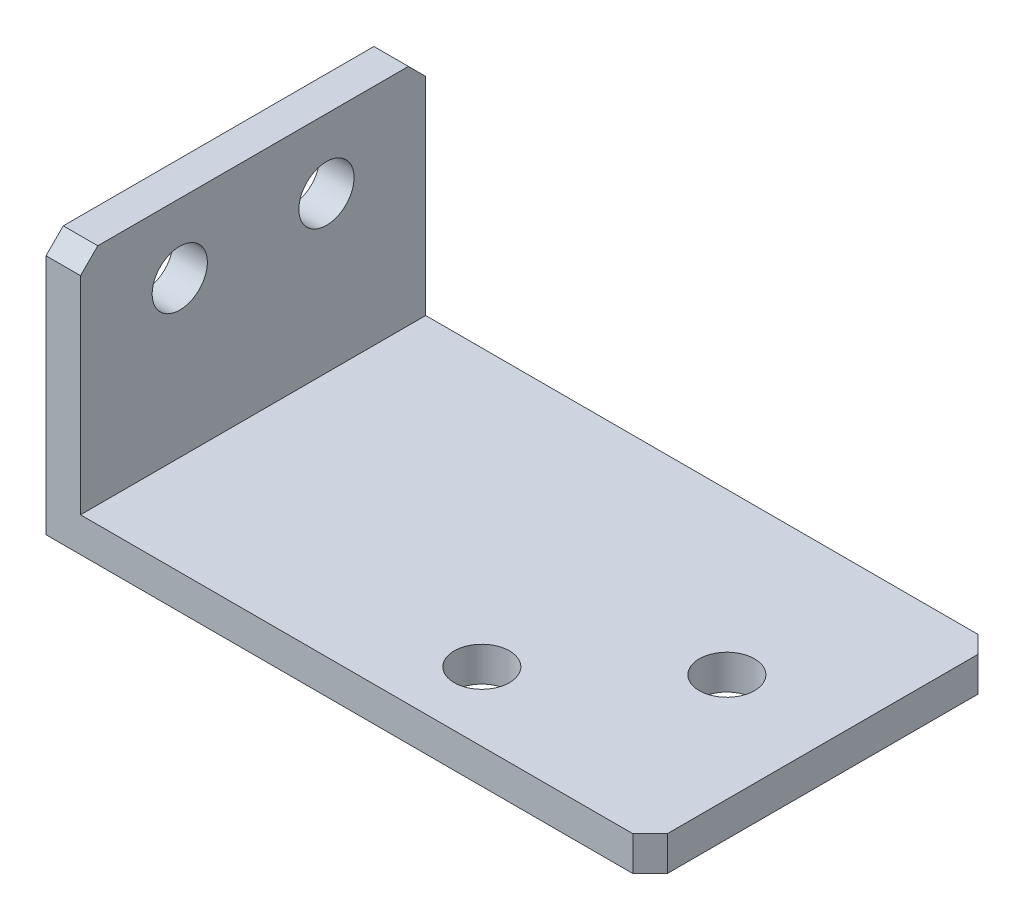
ISO-10303-21;
HEADER;
FILE_DESCRIPTION(('STEP AP214'),'2;1');
FILE_NAME('part.step','',(''),(''),'','','');
FILE_SCHEMA(('AUTOMOTIVE_DESIGN { 1 0 10303 214 1 1 1 1 }'));
ENDSEC;
DATA;
#1=APPLICATION_CONTEXT('core data for automotive mechanical design processes');
#2=APPLICATION_PROTOCOL_DEFINITION('international standard','automotive_design',2000,#1);
#3=PRODUCT_CONTEXT('',#1,'mechanical');
#4=PRODUCT('Part','Part','',(#3));
#5=PRODUCT_RELATED_PRODUCT_CATEGORY('part','',(#4));
#6=PRODUCT_DEFINITION_FORMATION('','',#4);
#7=PRODUCT_DEFINITION_CONTEXT('part definition',#1,'design');
#8=PRODUCT_DEFINITION('design','',#6,#7);
#9=PRODUCT_DEFINITION_SHAPE('','',#8);
#10=(LENGTH_UNIT() NAMED_UNIT(*) SI_UNIT(.MILLI.,.METRE.));
#11=(NAMED_UNIT(*) PLANE_ANGLE_UNIT() SI_UNIT($,.RADIAN.));
#12=(NAMED_UNIT(*) SI_UNIT($,.STERADIAN.) SOLID_ANGLE_UNIT());
#13=UNCERTAINTY_MEASURE_WITH_UNIT(LENGTH_MEASURE(1.E-05),#10,'distance_accuracy_value','');
#14=(GEOMETRIC_REPRESENTATION_CONTEXT(3) GLOBAL_UNCERTAINTY_ASSIGNED_CONTEXT((#13)) GLOBAL_UNIT_ASSIGNED_CONTEXT((#10,
#11,#12)) REPRESENTATION_CONTEXT('',''));
#15=CARTESIAN_POINT('',(0.,0.,0.));
#16=DIRECTION('',(0.,0.,1.));
#17=DIRECTION('',(1.,0.,0.));
#18=AXIS2_PLACEMENT_3D('',#15,#16,#17);
#19=CARTESIAN_POINT('',(0.,15.,20.));
#20=DIRECTION('',(1.,0.,0.));
#21=DIRECTION('',(0.,1.,0.));
#22=AXIS2_PLACEMENT_3D('',#19,#20,#21);
#23=PLANE('',#22);
#24=CARTESIAN_POINT('',(0.,11.,5.75));
#25=DIRECTION('',(-1.,0.,0.));
#26=DIRECTION('',(0.,0.,1.));
#27=AXIS2_PLACEMENT_3D('',#24,#25,#26);
#28=CIRCLE('',#27,1.59999999999999);
#29=CARTESIAN_POINT('',(0.,11.,7.34999999999999));
#30=VERTEX_POINT('',#29);
#31=EDGE_CURVE('E374',#30,#30,#28,.T.);
#32=ORIENTED_EDGE('',*,*,#31,.F.);
#33=EDGE_LOOP('',(#32));
#34=FACE_BOUND('',#33,.T.);
#35=CARTESIAN_POINT('',(0.,11.,14.25));
#36=DIRECTION('',(-1.,0.,0.));
#37=DIRECTION('',(0.,0.,1.));
#38=AXIS2_PLACEMENT_3D('',#35,#36,#37);
#39=CIRCLE('',#38,1.59999999999999);
#40=CARTESIAN_POINT('',(0.,11.,15.85));
#41=VERTEX_POINT('',#40);
#42=EDGE_CURVE('E380',#41,#41,#39,.T.);
#43=ORIENTED_EDGE('',*,*,#42,.F.);
#44=EDGE_LOOP('',(#43));
#45=FACE_BOUND('',#44,.T.);
#46=DIRECTION('',(0.,0.,-1.));
#47=VECTOR('',#46,1.);
#48=CARTESIAN_POINT('',(0.,15.,20.));
#49=LINE('',#48,#47);
#50=CARTESIAN_POINT('',(0.,15.,19.));
#51=VERTEX_POINT('',#50);
#52=CARTESIAN_POINT('',(0.,15.,0.999999999999997));
#53=VERTEX_POINT('',#52);
#54=EDGE_CURVE('E181',#51,#53,#49,.T.);
#55=ORIENTED_EDGE('',*,*,#54,.T.);
#56=DIRECTION('',(0.,0.70710678118655,0.707106781186545));
#57=VECTOR('',#56,1.);
#58=CARTESIAN_POINT('',(0.,15.,0.999999999999997));
#59=LINE('',#58,#57);
#60=CARTESIAN_POINT('',(0.,14.,0.));
#61=VERTEX_POINT('',#60);
#62=EDGE_CURVE('E166',#53,#61,#59,.F.);
#63=ORIENTED_EDGE('',*,*,#62,.T.);
#64=DIRECTION('',(0.,-1.,0.));
#65=VECTOR('',#64,1.);
#66=CARTESIAN_POINT('',(0.,15.,0.));
#67=LINE('',#66,#65);
#68=CARTESIAN_POINT('',(0.,0.,0.));
#69=VERTEX_POINT('',#68);
#70=EDGE_CURVE('E135',#61,#69,#67,.T.);
#71=ORIENTED_EDGE('',*,*,#70,.T.);
#72=DIRECTION('',(0.,0.,-1.));
#73=VECTOR('',#72,1.);
#74=CARTESIAN_POINT('',(0.,0.,20.));
#75=LINE('',#74,#73);
#76=CARTESIAN_POINT('',(0.,0.,20.));
#77=VERTEX_POINT('',#76);
#78=EDGE_CURVE('E127',#77,#69,#75,.T.);
#79=ORIENTED_EDGE('',*,*,#78,.F.);
#80=DIRECTION('',(0.,-1.,0.));
#81=VECTOR('',#80,1.);
#82=CARTESIAN_POINT('',(0.,15.,20.));
#83=LINE('',#82,#81);
#84=CARTESIAN_POINT('',(0.,14.,20.));
#85=VERTEX_POINT('',#84);
#86=EDGE_CURVE('E113',#85,#77,#83,.T.);
#87=ORIENTED_EDGE('',*,*,#86,.F.);
#88=DIRECTION('',(0.,0.707106781186545,-0.70710678118655));
#89=VECTOR('',#88,1.);
#90=CARTESIAN_POINT('',(0.,14.,20.));
#91=LINE('',#90,#89);
#92=EDGE_CURVE('E57',#85,#51,#91,.T.);
#93=ORIENTED_EDGE('',*,*,#92,.T.);
#94=EDGE_LOOP('',(#55,#63,#71,#79,#87,#93));
#95=FACE_BOUND('',#94,.T.);
#96=ADVANCED_FACE('F34',(#34,#45,#95),#23,.F.);
#97=CARTESIAN_POINT('',(0.,0.,20.));
#98=DIRECTION('',(0.,1.,0.));
#99=DIRECTION('',(0.,0.,1.));
#100=AXIS2_PLACEMENT_3D('',#97,#98,#99);
#101=PLANE('',#100);
#102=CARTESIAN_POINT('',(28.75,0.,9.3));
#103=DIRECTION('',(0.,-1.,0.));
#104=DIRECTION('',(0.,0.,-1.));
#105=AXIS2_PLACEMENT_3D('',#102,#103,#104);
#106=CIRCLE('',#105,1.6);
#107=CARTESIAN_POINT('',(28.75,0.,7.7));
#108=VERTEX_POINT('',#107);
#109=EDGE_CURVE('E361',#108,#108,#106,.T.);
#110=ORIENTED_EDGE('',*,*,#109,.F.);
#111=EDGE_LOOP('',(#110));
#112=FACE_BOUND('',#111,.T.);
#113=CARTESIAN_POINT('',(21.25,0.,16.));
#114=DIRECTION('',(0.,-1.,0.));
#115=DIRECTION('',(0.,0.,-1.));
#116=AXIS2_PLACEMENT_3D('',#113,#114,#115);
#117=CIRCLE('',#116,1.6);
#118=CARTESIAN_POINT('',(21.25,0.,14.4));
#119=VERTEX_POINT('',#118);
#120=EDGE_CURVE('E365',#119,#119,#117,.T.);
#121=ORIENTED_EDGE('',*,*,#120,.F.);
#122=EDGE_LOOP('',(#121));
#123=FACE_BOUND('',#122,.T.);
#124=DIRECTION('',(1.,0.,0.));
#125=VECTOR('',#124,1.);
#126=CARTESIAN_POINT('',(0.,0.,0.));
#127=LINE('',#126,#125);
#128=CARTESIAN_POINT('',(34.,0.,0.));
#129=VERTEX_POINT('',#128);
#130=EDGE_CURVE('E185',#69,#129,#127,.T.);
#131=ORIENTED_EDGE('',*,*,#130,.T.);
#132=DIRECTION('',(-0.707106781186549,0.,-0.707106781186546));
#133=VECTOR('',#132,1.);
#134=CARTESIAN_POINT('',(35.,0.,0.999999999999997));
#135=LINE('',#134,#133);
#136=CARTESIAN_POINT('',(35.,0.,0.999999999999997));
#137=VERTEX_POINT('',#136);
#138=EDGE_CURVE('E158',#129,#137,#135,.F.);
#139=ORIENTED_EDGE('',*,*,#138,.T.);
#140=DIRECTION('',(0.,0.,-1.));
#141=VECTOR('',#140,1.);
#142=CARTESIAN_POINT('',(35.,0.,20.));
#143=LINE('',#142,#141);
#144=CARTESIAN_POINT('',(35.,0.,19.));
#145=VERTEX_POINT('',#144);
#146=EDGE_CURVE('E138',#145,#137,#143,.T.);
#147=ORIENTED_EDGE('',*,*,#146,.F.);
#148=DIRECTION('',(-0.707106781186543,0.,0.707106781186552));
#149=VECTOR('',#148,1.);
#150=CARTESIAN_POINT('',(34.,0.,20.));
#151=LINE('',#150,#149);
#152=CARTESIAN_POINT('',(34.,0.,20.));
#153=VERTEX_POINT('',#152);
#154=EDGE_CURVE('E130',#145,#153,#151,.T.);
#155=ORIENTED_EDGE('',*,*,#154,.T.);
#156=DIRECTION('',(1.,0.,0.));
#157=VECTOR('',#156,1.);
#158=CARTESIAN_POINT('',(0.,0.,20.));
#159=LINE('',#158,#157);
#160=EDGE_CURVE('E117',#77,#153,#159,.T.);
#161=ORIENTED_EDGE('',*,*,#160,.F.);
#162=ORIENTED_EDGE('',*,*,#78,.T.);
#163=EDGE_LOOP('',(#131,#139,#147,#155,#161,#162));
#164=FACE_BOUND('',#163,.T.);
#165=ADVANCED_FACE('F126',(#112,#123,#164),#101,.F.);
#166=CARTESIAN_POINT('',(35.,0.,20.));
#167=DIRECTION('',(-1.,0.,0.));
#168=DIRECTION('',(0.,0.,1.));
#169=AXIS2_PLACEMENT_3D('',#166,#167,#168);
#170=PLANE('',#169);
#171=ORIENTED_EDGE('',*,*,#146,.T.);
#172=DIRECTION('',(0.,1.,0.));
#173=VECTOR('',#172,1.);
#174=CARTESIAN_POINT('',(35.,0.,0.999999999999997));
#175=LINE('',#174,#173);
#176=CARTESIAN_POINT('',(35.,2.,0.999999999999997));
#177=VERTEX_POINT('',#176);
#178=EDGE_CURVE('E140',#137,#177,#175,.T.);
#179=ORIENTED_EDGE('',*,*,#178,.T.);
#180=DIRECTION('',(0.,0.,-1.));
#181=VECTOR('',#180,1.);
#182=CARTESIAN_POINT('',(35.,2.,20.));
#183=LINE('',#182,#181);
#184=CARTESIAN_POINT('',(35.,2.,19.));
#185=VERTEX_POINT('',#184);
#186=EDGE_CURVE('E143',#185,#177,#183,.T.);
#187=ORIENTED_EDGE('',*,*,#186,.F.);
#188=DIRECTION('',(0.,-1.,0.));
#189=VECTOR('',#188,1.);
#190=CARTESIAN_POINT('',(35.,0.,19.));
#191=LINE('',#190,#189);
#192=EDGE_CURVE('E137',#185,#145,#191,.T.);
#193=ORIENTED_EDGE('',*,*,#192,.T.);
#194=EDGE_LOOP('',(#171,#179,#187,#193));
#195=FACE_BOUND('',#194,.T.);
#196=ADVANCED_FACE('F199',(#195),#170,.F.);
#197=CARTESIAN_POINT('',(35.,2.,20.));
#198=DIRECTION('',(0.,-1.,0.));
#199=DIRECTION('',(1.,0.,0.));
#200=AXIS2_PLACEMENT_3D('',#197,#198,#199);
#201=PLANE('',#200);
#202=CARTESIAN_POINT('',(28.75,2.,9.3));
#203=DIRECTION('',(0.,-1.,0.));
#204=DIRECTION('',(1.,0.,0.));
#205=AXIS2_PLACEMENT_3D('',#202,#203,#204);
#206=CIRCLE('',#205,1.6);
#207=CARTESIAN_POINT('',(30.35,2.,9.3));
#208=VERTEX_POINT('',#207);
#209=EDGE_CURVE('E364',#208,#208,#206,.T.);
#210=ORIENTED_EDGE('',*,*,#209,.T.);
#211=EDGE_LOOP('',(#210));
#212=FACE_BOUND('',#211,.T.);
#213=CARTESIAN_POINT('',(21.25,2.,16.));
#214=DIRECTION('',(0.,-1.,0.));
#215=DIRECTION('',(1.,0.,0.));
#216=AXIS2_PLACEMENT_3D('',#213,#214,#215);
#217=CIRCLE('',#216,1.6);
#218=CARTESIAN_POINT('',(22.85,2.,16.));
#219=VERTEX_POINT('',#218);
#220=EDGE_CURVE('E368',#219,#219,#217,.T.);
#221=ORIENTED_EDGE('',*,*,#220,.T.);
#222=EDGE_LOOP('',(#221));
#223=FACE_BOUND('',#222,.T.);
#224=ORIENTED_EDGE('',*,*,#186,.T.);
#225=DIRECTION('',(0.707106781186549,0.,0.707106781186546));
#226=VECTOR('',#225,1.);
#227=CARTESIAN_POINT('',(35.,2.,0.999999999999997));
#228=LINE('',#227,#226);
#229=CARTESIAN_POINT('',(34.,2.,0.));
#230=VERTEX_POINT('',#229);
#231=EDGE_CURVE('E151',#177,#230,#228,.F.);
#232=ORIENTED_EDGE('',*,*,#231,.T.);
#233=DIRECTION('',(-1.,0.,0.));
#234=VECTOR('',#233,1.);
#235=CARTESIAN_POINT('',(35.,2.,0.));
#236=LINE('',#235,#234);
#237=CARTESIAN_POINT('',(2.,2.,0.));
#238=VERTEX_POINT('',#237);
#239=EDGE_CURVE('E188',#230,#238,#236,.T.);
#240=ORIENTED_EDGE('',*,*,#239,.T.);
#241=DIRECTION('',(0.,0.,-1.));
#242=VECTOR('',#241,1.);
#243=CARTESIAN_POINT('',(2.,2.,20.));
#244=LINE('',#243,#242);
#245=CARTESIAN_POINT('',(2.,2.,20.));
#246=VERTEX_POINT('',#245);
#247=EDGE_CURVE('E178',#246,#238,#244,.T.);
#248=ORIENTED_EDGE('',*,*,#247,.F.);
#249=DIRECTION('',(-1.,0.,0.));
#250=VECTOR('',#249,1.);
#251=CARTESIAN_POINT('',(35.,2.,20.));
#252=LINE('',#251,#250);
#253=CARTESIAN_POINT('',(34.,2.,20.));
#254=VERTEX_POINT('',#253);
#255=EDGE_CURVE('E131',#254,#246,#252,.T.);
#256=ORIENTED_EDGE('',*,*,#255,.F.);
#257=DIRECTION('',(0.707106781186543,0.,-0.707106781186552));
#258=VECTOR('',#257,1.);
#259=CARTESIAN_POINT('',(34.,2.,20.));
#260=LINE('',#259,#258);
#261=EDGE_CURVE('E149',#254,#185,#260,.T.);
#262=ORIENTED_EDGE('',*,*,#261,.T.);
#263=EDGE_LOOP('',(#224,#232,#240,#248,#256,#262));
#264=FACE_BOUND('',#263,.T.);
#265=ADVANCED_FACE('F175',(#212,#223,#264),#201,.F.);
#266=CARTESIAN_POINT('',(2.,2.,20.));
#267=DIRECTION('',(-1.,0.,0.));
#268=DIRECTION('',(0.,-1.,0.));
#269=AXIS2_PLACEMENT_3D('',#266,#267,#268);
#270=PLANE('',#269);
#271=CARTESIAN_POINT('',(2.,11.,5.75));
#272=DIRECTION('',(-1.,0.,0.));
#273=DIRECTION('',(0.,-1.,0.));
#274=AXIS2_PLACEMENT_3D('',#271,#272,#273);
#275=CIRCLE('',#274,1.59999999999999);
#276=CARTESIAN_POINT('',(2.,9.40000000000001,5.75));
#277=VERTEX_POINT('',#276);
#278=EDGE_CURVE('E377',#277,#277,#275,.T.);
#279=ORIENTED_EDGE('',*,*,#278,.T.);
#280=EDGE_LOOP('',(#279));
#281=FACE_BOUND('',#280,.T.);
#282=CARTESIAN_POINT('',(2.,11.,14.25));
#283=DIRECTION('',(-1.,0.,0.));
#284=DIRECTION('',(0.,-1.,0.));
#285=AXIS2_PLACEMENT_3D('',#282,#283,#284);
#286=CIRCLE('',#285,1.59999999999999);
#287=CARTESIAN_POINT('',(2.,9.40000000000001,14.25));
#288=VERTEX_POINT('',#287);
#289=EDGE_CURVE('E186',#288,#288,#286,.T.);
#290=ORIENTED_EDGE('',*,*,#289,.T.);
#291=EDGE_LOOP('',(#290));
#292=FACE_BOUND('',#291,.T.);
#293=DIRECTION('',(0.,1.,0.));
#294=VECTOR('',#293,1.);
#295=CARTESIAN_POINT('',(2.,2.,0.));
#296=LINE('',#295,#294);
#297=CARTESIAN_POINT('',(2.,14.,0.));
#298=VERTEX_POINT('',#297);
#299=EDGE_CURVE('E121',#238,#298,#296,.T.);
#300=ORIENTED_EDGE('',*,*,#299,.T.);
#301=DIRECTION('',(0.,-0.70710678118655,-0.707106781186545));
#302=VECTOR('',#301,1.);
#303=CARTESIAN_POINT('',(2.,15.,0.999999999999997));
#304=LINE('',#303,#302);
#305=CARTESIAN_POINT('',(2.,15.,0.999999999999997));
#306=VERTEX_POINT('',#305);
#307=EDGE_CURVE('E169',#298,#306,#304,.F.);
#308=ORIENTED_EDGE('',*,*,#307,.T.);
#309=DIRECTION('',(0.,0.,-1.));
#310=VECTOR('',#309,1.);
#311=CARTESIAN_POINT('',(2.,15.,20.));
#312=LINE('',#311,#310);
#313=CARTESIAN_POINT('',(2.,15.,19.));
#314=VERTEX_POINT('',#313);
#315=EDGE_CURVE('E193',#314,#306,#312,.T.);
#316=ORIENTED_EDGE('',*,*,#315,.F.);
#317=DIRECTION('',(0.,-0.707106781186545,0.70710678118655));
#318=VECTOR('',#317,1.);
#319=CARTESIAN_POINT('',(2.,14.,20.));
#320=LINE('',#319,#318);
#321=CARTESIAN_POINT('',(2.,14.,20.));
#322=VERTEX_POINT('',#321);
#323=EDGE_CURVE('E49',#314,#322,#320,.T.);
#324=ORIENTED_EDGE('',*,*,#323,.T.);
#325=DIRECTION('',(0.,1.,0.));
#326=VECTOR('',#325,1.);
#327=CARTESIAN_POINT('',(2.,2.,20.));
#328=LINE('',#327,#326);
#329=EDGE_CURVE('E179',#246,#322,#328,.T.);
#330=ORIENTED_EDGE('',*,*,#329,.F.);
#331=ORIENTED_EDGE('',*,*,#247,.T.);
#332=EDGE_LOOP('',(#300,#308,#316,#324,#330,#331));
#333=FACE_BOUND('',#332,.T.);
#334=ADVANCED_FACE('F236',(#281,#292,#333),#270,.F.);
#335=CARTESIAN_POINT('',(2.,15.,20.));
#336=DIRECTION('',(0.,-1.,0.));
#337=DIRECTION('',(0.,0.,-1.));
#338=AXIS2_PLACEMENT_3D('',#335,#336,#337);
#339=PLANE('',#338);
#340=ORIENTED_EDGE('',*,*,#315,.T.);
#341=DIRECTION('',(-1.,0.,0.));
#342=VECTOR('',#341,1.);
#343=CARTESIAN_POINT('',(2.,15.,0.999999999999997));
#344=LINE('',#343,#342);
#345=EDGE_CURVE('E162',#306,#53,#344,.T.);
#346=ORIENTED_EDGE('',*,*,#345,.T.);
#347=ORIENTED_EDGE('',*,*,#54,.F.);
#348=DIRECTION('',(1.,0.,0.));
#349=VECTOR('',#348,1.);
#350=CARTESIAN_POINT('',(2.,15.,19.));
#351=LINE('',#350,#349);
#352=EDGE_CURVE('E160',#51,#314,#351,.T.);
#353=ORIENTED_EDGE('',*,*,#352,.T.);
#354=EDGE_LOOP('',(#340,#346,#347,#353));
#355=FACE_BOUND('',#354,.T.);
#356=ADVANCED_FACE('F239',(#355),#339,.F.);
#357=CARTESIAN_POINT('',(0.,0.,20.));
#358=DIRECTION('',(0.,0.,1.));
#359=DIRECTION('',(1.,0.,0.));
#360=AXIS2_PLACEMENT_3D('',#357,#358,#359);
#361=PLANE('',#360);
#362=ORIENTED_EDGE('',*,*,#329,.T.);
#363=DIRECTION('',(-1.,0.,0.));
#364=VECTOR('',#363,1.);
#365=CARTESIAN_POINT('',(0.,14.,20.));
#366=LINE('',#365,#364);
#367=EDGE_CURVE('E11',#322,#85,#366,.T.);
#368=ORIENTED_EDGE('',*,*,#367,.T.);
#369=ORIENTED_EDGE('',*,*,#86,.T.);
#370=ORIENTED_EDGE('',*,*,#160,.T.);
#371=DIRECTION('',(0.,1.,0.));
#372=VECTOR('',#371,1.);
#373=CARTESIAN_POINT('',(34.,2.,20.));
#374=LINE('',#373,#372);
#375=EDGE_CURVE('E42',#153,#254,#374,.T.);
#376=ORIENTED_EDGE('',*,*,#375,.T.);
#377=ORIENTED_EDGE('',*,*,#255,.T.);
#378=EDGE_LOOP('',(#362,#368,#369,#370,#376,#377));
#379=FACE_BOUND('',#378,.T.);
#380=ADVANCED_FACE('F115',(#379),#361,.T.);
#381=CARTESIAN_POINT('',(0.,0.,0.));
#382=DIRECTION('',(0.,0.,1.));
#383=DIRECTION('',(1.,0.,0.));
#384=AXIS2_PLACEMENT_3D('',#381,#382,#383);
#385=PLANE('',#384);
#386=ORIENTED_EDGE('',*,*,#239,.F.);
#387=DIRECTION('',(0.,-1.,0.));
#388=VECTOR('',#387,1.);
#389=CARTESIAN_POINT('',(34.,0.,0.));
#390=LINE('',#389,#388);
#391=EDGE_CURVE('E155',#230,#129,#390,.T.);
#392=ORIENTED_EDGE('',*,*,#391,.T.);
#393=ORIENTED_EDGE('',*,*,#130,.F.);
#394=ORIENTED_EDGE('',*,*,#70,.F.);
#395=DIRECTION('',(1.,0.,0.));
#396=VECTOR('',#395,1.);
#397=CARTESIAN_POINT('',(0.,14.,0.));
#398=LINE('',#397,#396);
#399=EDGE_CURVE('E153',#61,#298,#398,.T.);
#400=ORIENTED_EDGE('',*,*,#399,.T.);
#401=ORIENTED_EDGE('',*,*,#299,.F.);
#402=EDGE_LOOP('',(#386,#392,#393,#394,#400,#401));
#403=FACE_BOUND('',#402,.T.);
#404=ADVANCED_FACE('F227',(#403),#385,.F.);
#405=CARTESIAN_POINT('',(35.,0.,0.999999999999997));
#406=DIRECTION('',(-0.707106781186546,0.,0.707106781186549));
#407=DIRECTION('',(0.,1.,0.));
#408=AXIS2_PLACEMENT_3D('',#405,#406,#407);
#409=PLANE('',#408);
#410=ORIENTED_EDGE('',*,*,#138,.F.);
#411=ORIENTED_EDGE('',*,*,#391,.F.);
#412=ORIENTED_EDGE('',*,*,#231,.F.);
#413=ORIENTED_EDGE('',*,*,#178,.F.);
#414=EDGE_LOOP('',(#410,#411,#412,#413));
#415=FACE_BOUND('',#414,.T.);
#416=ADVANCED_FACE('F224',(#415),#409,.F.);
#417=CARTESIAN_POINT('',(2.,15.,0.999999999999997));
#418=DIRECTION('',(0.,-0.707106781186545,0.70710678118655));
#419=DIRECTION('',(-1.,0.,0.));
#420=AXIS2_PLACEMENT_3D('',#417,#418,#419);
#421=PLANE('',#420);
#422=ORIENTED_EDGE('',*,*,#307,.F.);
#423=ORIENTED_EDGE('',*,*,#399,.F.);
#424=ORIENTED_EDGE('',*,*,#62,.F.);
#425=ORIENTED_EDGE('',*,*,#345,.F.);
#426=EDGE_LOOP('',(#422,#423,#424,#425));
#427=FACE_BOUND('',#426,.T.);
#428=ADVANCED_FACE('F211',(#427),#421,.F.);
#429=CARTESIAN_POINT('',(0.,14.,20.));
#430=DIRECTION('',(0.,0.70710678118655,0.707106781186545));
#431=DIRECTION('',(1.,0.,0.));
#432=AXIS2_PLACEMENT_3D('',#429,#430,#431);
#433=PLANE('',#432);
#434=ORIENTED_EDGE('',*,*,#323,.F.);
#435=ORIENTED_EDGE('',*,*,#352,.F.);
#436=ORIENTED_EDGE('',*,*,#92,.F.);
#437=ORIENTED_EDGE('',*,*,#367,.F.);
#438=EDGE_LOOP('',(#434,#435,#436,#437));
#439=FACE_BOUND('',#438,.T.);
#440=ADVANCED_FACE('F203',(#439),#433,.T.);
#441=CARTESIAN_POINT('',(34.,0.,20.));
#442=DIRECTION('',(0.707106781186552,0.,0.707106781186543));
#443=DIRECTION('',(0.,-1.,0.));
#444=AXIS2_PLACEMENT_3D('',#441,#442,#443);
#445=PLANE('',#444);
#446=ORIENTED_EDGE('',*,*,#154,.F.);
#447=ORIENTED_EDGE('',*,*,#192,.F.);
#448=ORIENTED_EDGE('',*,*,#261,.F.);
#449=ORIENTED_EDGE('',*,*,#375,.F.);
#450=EDGE_LOOP('',(#446,#447,#448,#449));
#451=FACE_BOUND('',#450,.T.);
#452=ADVANCED_FACE('F36',(#451),#445,.T.);
#453=CARTESIAN_POINT('',(0.,11.,14.25));
#454=DIRECTION('',(-1.,0.,0.));
#455=DIRECTION('',(0.,0.,1.));
#456=AXIS2_PLACEMENT_3D('',#453,#454,#455);
#457=CYLINDRICAL_SURFACE('',#456,1.59999999999999);
#458=ORIENTED_EDGE('',*,*,#42,.T.);
#459=EDGE_LOOP('',(#458));
#460=FACE_BOUND('',#459,.T.);
#461=ORIENTED_EDGE('',*,*,#289,.F.);
#462=EDGE_LOOP('',(#461));
#463=FACE_BOUND('',#462,.T.);
#464=ADVANCED_FACE('F202',(#460,#463),#457,.F.);
#465=CARTESIAN_POINT('',(0.,11.,5.75));
#466=DIRECTION('',(-1.,0.,0.));
#467=DIRECTION('',(0.,0.,1.));
#468=AXIS2_PLACEMENT_3D('',#465,#466,#467);
#469=CYLINDRICAL_SURFACE('',#468,1.59999999999999);
#470=ORIENTED_EDGE('',*,*,#31,.T.);
#471=EDGE_LOOP('',(#470));
#472=FACE_BOUND('',#471,.T.);
#473=ORIENTED_EDGE('',*,*,#278,.F.);
#474=EDGE_LOOP('',(#473));
#475=FACE_BOUND('',#474,.T.);
#476=ADVANCED_FACE('F208',(#472,#475),#469,.F.);
#477=CARTESIAN_POINT('',(21.25,0.,16.));
#478=DIRECTION('',(0.,-1.,0.));
#479=DIRECTION('',(0.,0.,-1.));
#480=AXIS2_PLACEMENT_3D('',#477,#478,#479);
#481=CYLINDRICAL_SURFACE('',#480,1.6);
#482=ORIENTED_EDGE('',*,*,#120,.T.);
#483=EDGE_LOOP('',(#482));
#484=FACE_BOUND('',#483,.T.);
#485=ORIENTED_EDGE('',*,*,#220,.F.);
#486=EDGE_LOOP('',(#485));
#487=FACE_BOUND('',#486,.T.);
#488=ADVANCED_FACE('F330',(#484,#487),#481,.F.);
#489=CARTESIAN_POINT('',(28.75,0.,9.3));
#490=DIRECTION('',(0.,-1.,0.));
#491=DIRECTION('',(0.,0.,-1.));
#492=AXIS2_PLACEMENT_3D('',#489,#490,#491);
#493=CYLINDRICAL_SURFACE('',#492,1.6);
#494=ORIENTED_EDGE('',*,*,#109,.T.);
#495=EDGE_LOOP('',(#494));
#496=FACE_BOUND('',#495,.T.);
#497=ORIENTED_EDGE('',*,*,#209,.F.);
#498=EDGE_LOOP('',(#497));
#499=FACE_BOUND('',#498,.T.);
#500=ADVANCED_FACE('F344',(#496,#499),#493,.F.);
#501=CLOSED_SHELL('',(#96,#165,#196,#265,#334,#356,#380,#404,#416,#428,#440,#452,#464,#476,#488,#500));
#502=MANIFOLD_SOLID_BREP('B2',#501);
#503=ADVANCED_BREP_SHAPE_REPRESENTATION('',(#18,#502),#14);
#504=SHAPE_DEFINITION_REPRESENTATION(#9,#503);
ENDSEC;
END-ISO-10303-21;
